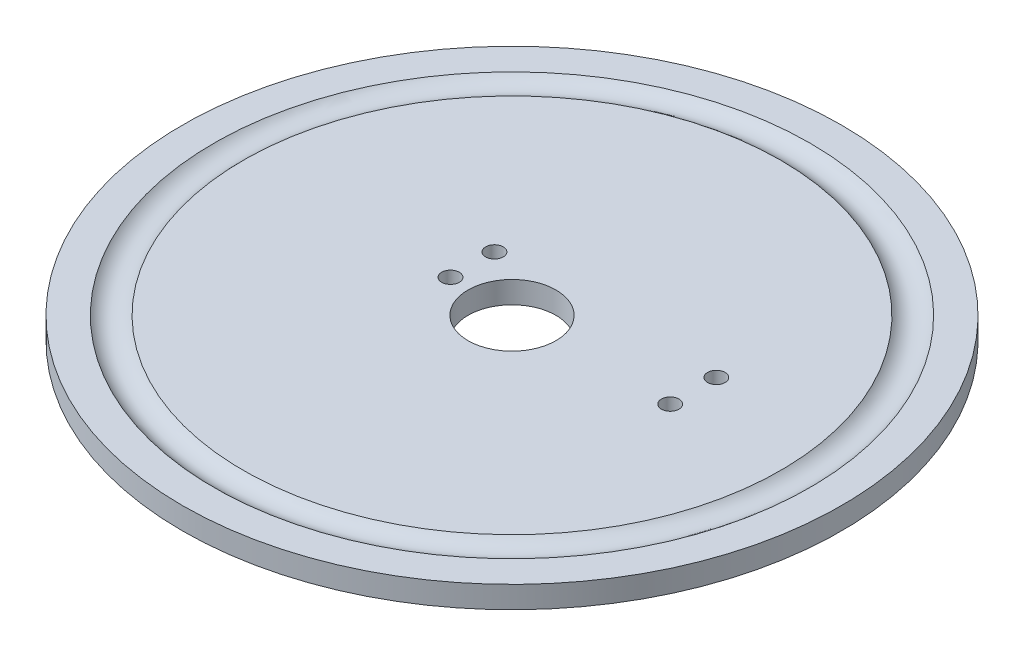
ISO-10303-21;
HEADER;
FILE_DESCRIPTION(('STEP AP214'),'2;1');
FILE_NAME('part.step','',(''),(''),'','','');
FILE_SCHEMA(('AUTOMOTIVE_DESIGN { 1 0 10303 214 1 1 1 1 }'));
ENDSEC;
DATA;
#1=APPLICATION_CONTEXT('core data for automotive mechanical design processes');
#2=APPLICATION_PROTOCOL_DEFINITION('international standard','automotive_design',2000,#1);
#3=PRODUCT_CONTEXT('',#1,'mechanical');
#4=PRODUCT('Part','Part','',(#3));
#5=PRODUCT_RELATED_PRODUCT_CATEGORY('part','',(#4));
#6=PRODUCT_DEFINITION_FORMATION('','',#4);
#7=PRODUCT_DEFINITION_CONTEXT('part definition',#1,'design');
#8=PRODUCT_DEFINITION('design','',#6,#7);
#9=PRODUCT_DEFINITION_SHAPE('','',#8);
#10=(LENGTH_UNIT() NAMED_UNIT(*) SI_UNIT(.MILLI.,.METRE.));
#11=(NAMED_UNIT(*) PLANE_ANGLE_UNIT() SI_UNIT($,.RADIAN.));
#12=(NAMED_UNIT(*) SI_UNIT($,.STERADIAN.) SOLID_ANGLE_UNIT());
#13=UNCERTAINTY_MEASURE_WITH_UNIT(LENGTH_MEASURE(1.E-05),#10,'distance_accuracy_value','');
#14=(GEOMETRIC_REPRESENTATION_CONTEXT(3) GLOBAL_UNCERTAINTY_ASSIGNED_CONTEXT((#13)) GLOBAL_UNIT_ASSIGNED_CONTEXT((#10,
#11,#12)) REPRESENTATION_CONTEXT('',''));
#15=CARTESIAN_POINT('',(0.,0.,0.));
#16=DIRECTION('',(0.,0.,1.));
#17=DIRECTION('',(1.,0.,0.));
#18=AXIS2_PLACEMENT_3D('',#15,#16,#17);
#19=CARTESIAN_POINT('',(0.,2.5,0.));
#20=DIRECTION('',(0.,1.,0.));
#21=DIRECTION('',(0.,0.,1.));
#22=AXIS2_PLACEMENT_3D('',#19,#20,#21);
#23=PLANE('',#22);
#24=CARTESIAN_POINT('',(0.,2.5,0.));
#25=DIRECTION('',(0.,1.,0.));
#26=DIRECTION('',(0.,0.,1.));
#27=AXIS2_PLACEMENT_3D('',#24,#25,#26);
#28=CIRCLE('',#27,75.);
#29=CARTESIAN_POINT('',(0.,2.5,75.));
#30=VERTEX_POINT('',#29);
#31=EDGE_CURVE('E75',#30,#30,#28,.T.);
#32=ORIENTED_EDGE('',*,*,#31,.T.);
#33=EDGE_LOOP('',(#32));
#34=FACE_BOUND('',#33,.T.);
#35=CARTESIAN_POINT('',(0.,2.5,0.));
#36=DIRECTION('',(0.,1.,0.));
#37=DIRECTION('',(0.,0.,1.));
#38=AXIS2_PLACEMENT_3D('',#35,#36,#37);
#39=CIRCLE('',#38,67.8541019662497);
#40=CARTESIAN_POINT('',(0.,2.5,-67.8541019662497));
#41=VERTEX_POINT('',#40);
#42=EDGE_CURVE('E11',#41,#41,#39,.F.);
#43=ORIENTED_EDGE('',*,*,#42,.T.);
#44=EDGE_LOOP('',(#43));
#45=FACE_BOUND('',#44,.T.);
#46=ADVANCED_FACE('F38',(#34,#45),#23,.T.);
#47=CARTESIAN_POINT('',(-14.5,2.5,-0.499999999999994));
#48=DIRECTION('',(0.,1.,0.));
#49=DIRECTION('',(0.,0.,1.));
#50=AXIS2_PLACEMENT_3D('',#47,#48,#49);
#51=CIRCLE('',#50,2.);
#52=CARTESIAN_POINT('',(-14.5,2.5,1.50000000000001));
#53=VERTEX_POINT('',#52);
#54=EDGE_CURVE('E153',#53,#53,#51,.T.);
#55=ORIENTED_EDGE('',*,*,#54,.F.);
#56=EDGE_LOOP('',(#55));
#57=FACE_BOUND('',#56,.T.);
#58=CARTESIAN_POINT('',(35.5,2.5,-0.5));
#59=DIRECTION('',(0.,1.,0.));
#60=DIRECTION('',(0.,0.,1.));
#61=AXIS2_PLACEMENT_3D('',#58,#59,#60);
#62=CIRCLE('',#61,2.);
#63=CARTESIAN_POINT('',(35.5,2.5,1.5));
#64=VERTEX_POINT('',#63);
#65=EDGE_CURVE('E145',#64,#64,#62,.T.);
#66=ORIENTED_EDGE('',*,*,#65,.F.);
#67=EDGE_LOOP('',(#66));
#68=FACE_BOUND('',#67,.T.);
#69=CARTESIAN_POINT('',(35.5,2.5,-11.));
#70=DIRECTION('',(0.,1.,0.));
#71=DIRECTION('',(0.,0.,1.));
#72=AXIS2_PLACEMENT_3D('',#69,#70,#71);
#73=CIRCLE('',#72,2.);
#74=CARTESIAN_POINT('',(35.5,2.5,-9.));
#75=VERTEX_POINT('',#74);
#76=EDGE_CURVE('E138',#75,#75,#73,.T.);
#77=ORIENTED_EDGE('',*,*,#76,.F.);
#78=EDGE_LOOP('',(#77));
#79=FACE_BOUND('',#78,.T.);
#80=CARTESIAN_POINT('',(-14.5,2.5,-10.5));
#81=DIRECTION('',(0.,1.,0.));
#82=DIRECTION('',(0.,0.,1.));
#83=AXIS2_PLACEMENT_3D('',#80,#81,#82);
#84=CIRCLE('',#83,2.);
#85=CARTESIAN_POINT('',(-14.5,2.5,-8.49999999999999));
#86=VERTEX_POINT('',#85);
#87=EDGE_CURVE('E67',#86,#86,#84,.T.);
#88=ORIENTED_EDGE('',*,*,#87,.F.);
#89=EDGE_LOOP('',(#88));
#90=FACE_BOUND('',#89,.T.);
#91=CARTESIAN_POINT('',(0.,2.5,0.));
#92=DIRECTION('',(0.,1.,0.));
#93=DIRECTION('',(0.,0.,1.));
#94=AXIS2_PLACEMENT_3D('',#91,#92,#93);
#95=CIRCLE('',#94,10.);
#96=CARTESIAN_POINT('',(0.,2.5,10.));
#97=VERTEX_POINT('',#96);
#98=EDGE_CURVE('E58',#97,#97,#95,.T.);
#99=ORIENTED_EDGE('',*,*,#98,.F.);
#100=EDGE_LOOP('',(#99));
#101=FACE_BOUND('',#100,.T.);
#102=CARTESIAN_POINT('',(0.,2.5,0.));
#103=DIRECTION('',(0.,-1.,0.));
#104=DIRECTION('',(0.,0.,-1.));
#105=AXIS2_PLACEMENT_3D('',#102,#103,#104);
#106=CIRCLE('',#105,61.1458980337503);
#107=CARTESIAN_POINT('',(0.,2.5,-61.1458980337503));
#108=VERTEX_POINT('',#107);
#109=EDGE_CURVE('E47',#108,#108,#106,.F.);
#110=ORIENTED_EDGE('',*,*,#109,.T.);
#111=EDGE_LOOP('',(#110));
#112=FACE_BOUND('',#111,.T.);
#113=ADVANCED_FACE('F83',(#57,#68,#79,#90,#101,#112),#23,.T.);
#114=CARTESIAN_POINT('',(0.,2.5,0.));
#115=DIRECTION('',(0.,-1.,0.));
#116=DIRECTION('',(0.,0.,-1.));
#117=AXIS2_PLACEMENT_3D('',#114,#115,#116);
#118=CYLINDRICAL_SURFACE('',#117,75.);
#119=ORIENTED_EDGE('',*,*,#31,.F.);
#120=EDGE_LOOP('',(#119));
#121=FACE_BOUND('',#120,.T.);
#122=CARTESIAN_POINT('',(0.,-2.5,0.));
#123=DIRECTION('',(0.,1.,0.));
#124=DIRECTION('',(0.,0.,1.));
#125=AXIS2_PLACEMENT_3D('',#122,#123,#124);
#126=CIRCLE('',#125,75.);
#127=CARTESIAN_POINT('',(0.,-2.5,75.));
#128=VERTEX_POINT('',#127);
#129=EDGE_CURVE('E73',#128,#128,#126,.T.);
#130=ORIENTED_EDGE('',*,*,#129,.T.);
#131=EDGE_LOOP('',(#130));
#132=FACE_BOUND('',#131,.T.);
#133=ADVANCED_FACE('F40',(#121,#132),#118,.T.);
#134=CARTESIAN_POINT('',(0.,-2.5,0.));
#135=DIRECTION('',(0.,1.,0.));
#136=DIRECTION('',(0.,0.,1.));
#137=AXIS2_PLACEMENT_3D('',#134,#135,#136);
#138=PLANE('',#137);
#139=CARTESIAN_POINT('',(-14.5,-2.5,-0.499999999999994));
#140=DIRECTION('',(0.,1.,0.));
#141=DIRECTION('',(0.,0.,1.));
#142=AXIS2_PLACEMENT_3D('',#139,#140,#141);
#143=CIRCLE('',#142,2.);
#144=CARTESIAN_POINT('',(-14.5,-2.5,1.50000000000001));
#145=VERTEX_POINT('',#144);
#146=EDGE_CURVE('E110',#145,#145,#143,.T.);
#147=ORIENTED_EDGE('',*,*,#146,.T.);
#148=EDGE_LOOP('',(#147));
#149=FACE_BOUND('',#148,.T.);
#150=CARTESIAN_POINT('',(35.5,-2.5,-0.5));
#151=DIRECTION('',(0.,1.,0.));
#152=DIRECTION('',(0.,0.,1.));
#153=AXIS2_PLACEMENT_3D('',#150,#151,#152);
#154=CIRCLE('',#153,2.);
#155=CARTESIAN_POINT('',(35.5,-2.5,1.5));
#156=VERTEX_POINT('',#155);
#157=EDGE_CURVE('E114',#156,#156,#154,.T.);
#158=ORIENTED_EDGE('',*,*,#157,.T.);
#159=EDGE_LOOP('',(#158));
#160=FACE_BOUND('',#159,.T.);
#161=CARTESIAN_POINT('',(35.5,-2.5,-11.));
#162=DIRECTION('',(0.,1.,0.));
#163=DIRECTION('',(0.,0.,1.));
#164=AXIS2_PLACEMENT_3D('',#161,#162,#163);
#165=CIRCLE('',#164,2.);
#166=CARTESIAN_POINT('',(35.5,-2.5,-9.));
#167=VERTEX_POINT('',#166);
#168=EDGE_CURVE('E118',#167,#167,#165,.T.);
#169=ORIENTED_EDGE('',*,*,#168,.T.);
#170=EDGE_LOOP('',(#169));
#171=FACE_BOUND('',#170,.T.);
#172=CARTESIAN_POINT('',(-14.5,-2.5,-10.5));
#173=DIRECTION('',(0.,1.,0.));
#174=DIRECTION('',(0.,0.,1.));
#175=AXIS2_PLACEMENT_3D('',#172,#173,#174);
#176=CIRCLE('',#175,2.);
#177=CARTESIAN_POINT('',(-14.5,-2.5,-8.49999999999999));
#178=VERTEX_POINT('',#177);
#179=EDGE_CURVE('E59',#178,#178,#176,.T.);
#180=ORIENTED_EDGE('',*,*,#179,.T.);
#181=EDGE_LOOP('',(#180));
#182=FACE_BOUND('',#181,.T.);
#183=CARTESIAN_POINT('',(0.,-2.5,0.));
#184=DIRECTION('',(0.,1.,0.));
#185=DIRECTION('',(0.,0.,1.));
#186=AXIS2_PLACEMENT_3D('',#183,#184,#185);
#187=CIRCLE('',#186,10.);
#188=CARTESIAN_POINT('',(0.,-2.5,10.));
#189=VERTEX_POINT('',#188);
#190=EDGE_CURVE('E64',#189,#189,#187,.T.);
#191=ORIENTED_EDGE('',*,*,#190,.T.);
#192=EDGE_LOOP('',(#191));
#193=FACE_BOUND('',#192,.T.);
#194=ORIENTED_EDGE('',*,*,#129,.F.);
#195=EDGE_LOOP('',(#194));
#196=FACE_BOUND('',#195,.T.);
#197=ADVANCED_FACE('F92',(#149,#160,#171,#182,#193,#196),#138,.F.);
#198=CARTESIAN_POINT('',(0.,-2.5,0.));
#199=DIRECTION('',(0.,1.,0.));
#200=DIRECTION('',(0.,0.,1.));
#201=AXIS2_PLACEMENT_3D('',#198,#199,#200);
#202=CYLINDRICAL_SURFACE('',#201,10.);
#203=ORIENTED_EDGE('',*,*,#190,.F.);
#204=EDGE_LOOP('',(#203));
#205=FACE_BOUND('',#204,.T.);
#206=ORIENTED_EDGE('',*,*,#98,.T.);
#207=EDGE_LOOP('',(#206));
#208=FACE_BOUND('',#207,.T.);
#209=ADVANCED_FACE('F99',(#205,#208),#202,.F.);
#210=CARTESIAN_POINT('',(0.,5.50000000000002,0.));
#211=DIRECTION('',(0.,1.,0.));
#212=DIRECTION('',(0.,0.,1.));
#213=AXIS2_PLACEMENT_3D('',#210,#211,#212);
#214=TOROIDAL_SURFACE('',#213,64.5,4.5);
#215=CARTESIAN_POINT('',(0.,5.50000000000002,-64.5));
#216=DIRECTION('',(1.,0.,0.));
#217=DIRECTION('',(0.,0.,-1.));
#218=AXIS2_PLACEMENT_3D('',#215,#216,#217);
#219=CIRCLE('',#218,4.5);
#220=EDGE_CURVE('E54',#108,#41,#219,.T.);
#221=ORIENTED_EDGE('',*,*,#220,.F.);
#222=ORIENTED_EDGE('',*,*,#109,.F.);
#223=ORIENTED_EDGE('',*,*,#220,.T.);
#224=ORIENTED_EDGE('',*,*,#42,.F.);
#225=EDGE_LOOP('',(#221,#222,#223,#224));
#226=FACE_BOUND('',#225,.T.);
#227=ADVANCED_FACE('F55',(#226),#214,.F.);
#228=CARTESIAN_POINT('',(-14.5,-2.5,-10.5));
#229=DIRECTION('',(0.,1.,0.));
#230=DIRECTION('',(0.,0.,1.));
#231=AXIS2_PLACEMENT_3D('',#228,#229,#230);
#232=CYLINDRICAL_SURFACE('',#231,2.);
#233=ORIENTED_EDGE('',*,*,#179,.F.);
#234=EDGE_LOOP('',(#233));
#235=FACE_BOUND('',#234,.T.);
#236=ORIENTED_EDGE('',*,*,#87,.T.);
#237=EDGE_LOOP('',(#236));
#238=FACE_BOUND('',#237,.T.);
#239=ADVANCED_FACE('F129',(#235,#238),#232,.F.);
#240=CARTESIAN_POINT('',(35.5,-2.5,-11.));
#241=DIRECTION('',(0.,1.,0.));
#242=DIRECTION('',(0.,0.,1.));
#243=AXIS2_PLACEMENT_3D('',#240,#241,#242);
#244=CYLINDRICAL_SURFACE('',#243,2.);
#245=ORIENTED_EDGE('',*,*,#168,.F.);
#246=EDGE_LOOP('',(#245));
#247=FACE_BOUND('',#246,.T.);
#248=ORIENTED_EDGE('',*,*,#76,.T.);
#249=EDGE_LOOP('',(#248));
#250=FACE_BOUND('',#249,.T.);
#251=ADVANCED_FACE('F132',(#247,#250),#244,.F.);
#252=CARTESIAN_POINT('',(35.5,-2.5,-0.5));
#253=DIRECTION('',(0.,1.,0.));
#254=DIRECTION('',(0.,0.,1.));
#255=AXIS2_PLACEMENT_3D('',#252,#253,#254);
#256=CYLINDRICAL_SURFACE('',#255,2.);
#257=ORIENTED_EDGE('',*,*,#157,.F.);
#258=EDGE_LOOP('',(#257));
#259=FACE_BOUND('',#258,.T.);
#260=ORIENTED_EDGE('',*,*,#65,.T.);
#261=EDGE_LOOP('',(#260));
#262=FACE_BOUND('',#261,.T.);
#263=ADVANCED_FACE('F161',(#259,#262),#256,.F.);
#264=CARTESIAN_POINT('',(-14.5,-2.5,-0.499999999999994));
#265=DIRECTION('',(0.,1.,0.));
#266=DIRECTION('',(0.,0.,1.));
#267=AXIS2_PLACEMENT_3D('',#264,#265,#266);
#268=CYLINDRICAL_SURFACE('',#267,2.);
#269=ORIENTED_EDGE('',*,*,#146,.F.);
#270=EDGE_LOOP('',(#269));
#271=FACE_BOUND('',#270,.T.);
#272=ORIENTED_EDGE('',*,*,#54,.T.);
#273=EDGE_LOOP('',(#272));
#274=FACE_BOUND('',#273,.T.);
#275=ADVANCED_FACE('F159',(#271,#274),#268,.F.);
#276=CLOSED_SHELL('',(#46,#113,#133,#197,#209,#227,#239,#251,#263,#275));
#277=MANIFOLD_SOLID_BREP('B2',#276);
#278=ADVANCED_BREP_SHAPE_REPRESENTATION('',(#18,#277),#14);
#279=SHAPE_DEFINITION_REPRESENTATION(#9,#278);
ENDSEC;
END-ISO-10303-21;
